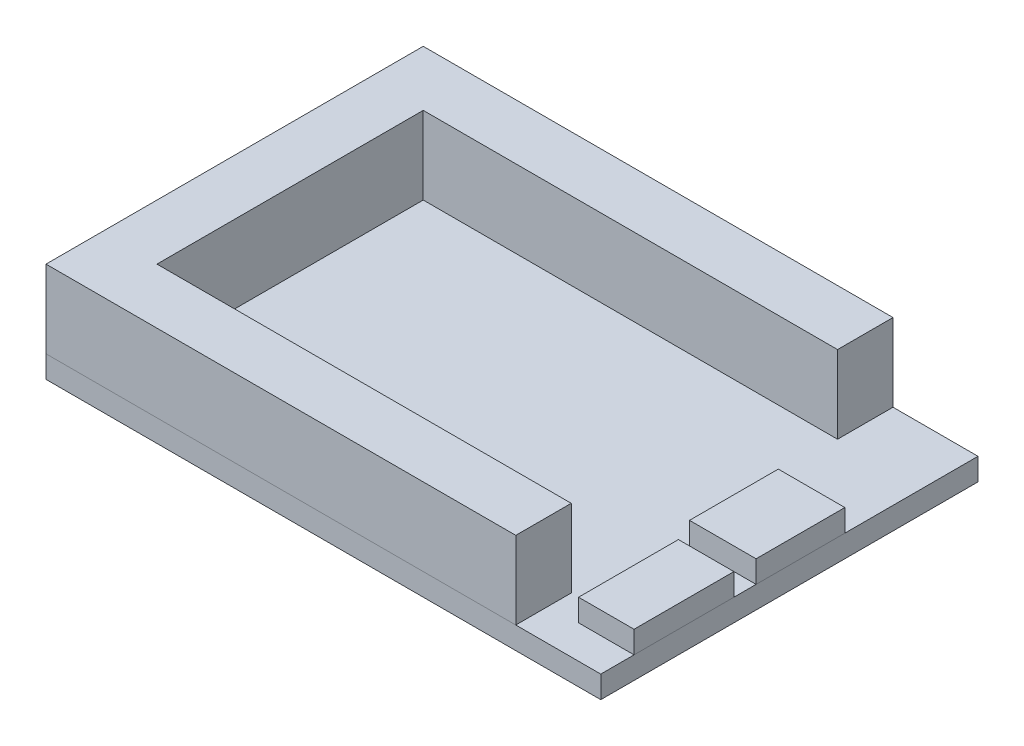
ISO-10303-21;
HEADER;
FILE_DESCRIPTION(('STEP AP214'),'2;1');
FILE_NAME('part.step','',(''),(''),'','','');
FILE_SCHEMA(('AUTOMOTIVE_DESIGN { 1 0 10303 214 1 1 1 1 }'));
ENDSEC;
DATA;
#1=APPLICATION_CONTEXT('core data for automotive mechanical design processes');
#2=APPLICATION_PROTOCOL_DEFINITION('international standard','automotive_design',2000,#1);
#3=PRODUCT_CONTEXT('',#1,'mechanical');
#4=PRODUCT('Part','Part','',(#3));
#5=PRODUCT_RELATED_PRODUCT_CATEGORY('part','',(#4));
#6=PRODUCT_DEFINITION_FORMATION('','',#4);
#7=PRODUCT_DEFINITION_CONTEXT('part definition',#1,'design');
#8=PRODUCT_DEFINITION('design','',#6,#7);
#9=PRODUCT_DEFINITION_SHAPE('','',#8);
#10=(LENGTH_UNIT() NAMED_UNIT(*) SI_UNIT(.MILLI.,.METRE.));
#11=(NAMED_UNIT(*) PLANE_ANGLE_UNIT() SI_UNIT($,.RADIAN.));
#12=(NAMED_UNIT(*) SI_UNIT($,.STERADIAN.) SOLID_ANGLE_UNIT());
#13=UNCERTAINTY_MEASURE_WITH_UNIT(LENGTH_MEASURE(1.E-05),#10,'distance_accuracy_value','');
#14=(GEOMETRIC_REPRESENTATION_CONTEXT(3) GLOBAL_UNCERTAINTY_ASSIGNED_CONTEXT((#13)) GLOBAL_UNIT_ASSIGNED_CONTEXT((#10,
#11,#12)) REPRESENTATION_CONTEXT('',''));
#15=CARTESIAN_POINT('',(0.,0.,0.));
#16=DIRECTION('',(0.,0.,1.));
#17=DIRECTION('',(1.,0.,0.));
#18=AXIS2_PLACEMENT_3D('',#15,#16,#17);
#19=CARTESIAN_POINT('',(17.3404490864808,9.,-17.));
#20=DIRECTION('',(0.,0.,1.));
#21=DIRECTION('',(1.,0.,0.));
#22=AXIS2_PLACEMENT_3D('',#19,#20,#21);
#23=PLANE('',#22);
#24=DIRECTION('',(-1.,0.,0.));
#25=VECTOR('',#24,1.);
#26=CARTESIAN_POINT('',(17.3404490864808,2.,-17.));
#27=LINE('',#26,#25);
#28=CARTESIAN_POINT('',(17.3404490864808,2.,-17.));
#29=VERTEX_POINT('',#28);
#30=CARTESIAN_POINT('',(-25.,2.,-17.));
#31=VERTEX_POINT('',#30);
#32=EDGE_CURVE('E150',#29,#31,#27,.T.);
#33=ORIENTED_EDGE('',*,*,#32,.T.);
#34=DIRECTION('',(0.,-1.,0.));
#35=VECTOR('',#34,1.);
#36=CARTESIAN_POINT('',(-25.,9.,-17.));
#37=LINE('',#36,#35);
#38=CARTESIAN_POINT('',(-25.,9.,-17.));
#39=VERTEX_POINT('',#38);
#40=EDGE_CURVE('E12',#39,#31,#37,.T.);
#41=ORIENTED_EDGE('',*,*,#40,.F.);
#42=DIRECTION('',(-1.,0.,0.));
#43=VECTOR('',#42,1.);
#44=CARTESIAN_POINT('',(17.3404490864808,9.,-17.));
#45=LINE('',#44,#43);
#46=CARTESIAN_POINT('',(17.3404490864808,9.,-17.));
#47=VERTEX_POINT('',#46);
#48=EDGE_CURVE('E164',#47,#39,#45,.T.);
#49=ORIENTED_EDGE('',*,*,#48,.F.);
#50=DIRECTION('',(0.,-1.,0.));
#51=VECTOR('',#50,1.);
#52=CARTESIAN_POINT('',(17.3404490864808,9.,-17.));
#53=LINE('',#52,#51);
#54=EDGE_CURVE('E146',#47,#29,#53,.T.);
#55=ORIENTED_EDGE('',*,*,#54,.T.);
#56=EDGE_LOOP('',(#33,#41,#49,#55));
#57=FACE_BOUND('',#56,.T.);
#58=ADVANCED_FACE('F54',(#57),#23,.F.);
#59=CARTESIAN_POINT('',(-25.,9.,-17.));
#60=DIRECTION('',(1.,0.,0.));
#61=DIRECTION('',(0.,0.,-1.));
#62=AXIS2_PLACEMENT_3D('',#59,#60,#61);
#63=PLANE('',#62);
#64=DIRECTION('',(0.,0.,1.));
#65=VECTOR('',#64,1.);
#66=CARTESIAN_POINT('',(-25.,2.,-17.));
#67=LINE('',#66,#65);
#68=CARTESIAN_POINT('',(-25.,2.,17.));
#69=VERTEX_POINT('',#68);
#70=EDGE_CURVE('E153',#31,#69,#67,.T.);
#71=ORIENTED_EDGE('',*,*,#70,.T.);
#72=DIRECTION('',(0.,-1.,0.));
#73=VECTOR('',#72,1.);
#74=CARTESIAN_POINT('',(-25.,9.,17.));
#75=LINE('',#74,#73);
#76=CARTESIAN_POINT('',(-25.,9.,17.));
#77=VERTEX_POINT('',#76);
#78=EDGE_CURVE('E62',#77,#69,#75,.T.);
#79=ORIENTED_EDGE('',*,*,#78,.F.);
#80=DIRECTION('',(0.,0.,1.));
#81=VECTOR('',#80,1.);
#82=CARTESIAN_POINT('',(-25.,9.,-17.));
#83=LINE('',#82,#81);
#84=EDGE_CURVE('E113',#39,#77,#83,.T.);
#85=ORIENTED_EDGE('',*,*,#84,.F.);
#86=ORIENTED_EDGE('',*,*,#40,.T.);
#87=EDGE_LOOP('',(#71,#79,#85,#86));
#88=FACE_BOUND('',#87,.T.);
#89=ADVANCED_FACE('F199',(#88),#63,.F.);
#90=CARTESIAN_POINT('',(-25.,9.,17.));
#91=DIRECTION('',(0.,0.,-1.));
#92=DIRECTION('',(-1.,0.,0.));
#93=AXIS2_PLACEMENT_3D('',#90,#91,#92);
#94=PLANE('',#93);
#95=DIRECTION('',(1.,0.,0.));
#96=VECTOR('',#95,1.);
#97=CARTESIAN_POINT('',(-25.,2.,17.));
#98=LINE('',#97,#96);
#99=CARTESIAN_POINT('',(17.3404490864808,2.,17.));
#100=VERTEX_POINT('',#99);
#101=EDGE_CURVE('E155',#69,#100,#98,.T.);
#102=ORIENTED_EDGE('',*,*,#101,.T.);
#103=DIRECTION('',(0.,-1.,0.));
#104=VECTOR('',#103,1.);
#105=CARTESIAN_POINT('',(17.3404490864808,9.,17.));
#106=LINE('',#105,#104);
#107=CARTESIAN_POINT('',(17.3404490864808,9.,17.));
#108=VERTEX_POINT('',#107);
#109=EDGE_CURVE('E171',#108,#100,#106,.T.);
#110=ORIENTED_EDGE('',*,*,#109,.F.);
#111=DIRECTION('',(1.,0.,0.));
#112=VECTOR('',#111,1.);
#113=CARTESIAN_POINT('',(-25.,9.,17.));
#114=LINE('',#113,#112);
#115=EDGE_CURVE('E179',#77,#108,#114,.T.);
#116=ORIENTED_EDGE('',*,*,#115,.F.);
#117=ORIENTED_EDGE('',*,*,#78,.T.);
#118=EDGE_LOOP('',(#102,#110,#116,#117));
#119=FACE_BOUND('',#118,.T.);
#120=ADVANCED_FACE('F177',(#119),#94,.F.);
#121=CARTESIAN_POINT('',(17.3404490864808,9.,12.));
#122=DIRECTION('',(-1.,0.,0.));
#123=DIRECTION('',(0.,0.,1.));
#124=AXIS2_PLACEMENT_3D('',#121,#122,#123);
#125=PLANE('',#124);
#126=DIRECTION('',(0.,0.,-1.));
#127=VECTOR('',#126,1.);
#128=CARTESIAN_POINT('',(17.3404490864808,2.,12.));
#129=LINE('',#128,#127);
#130=CARTESIAN_POINT('',(17.3404490864808,2.,12.));
#131=VERTEX_POINT('',#130);
#132=EDGE_CURVE('E157',#100,#131,#129,.T.);
#133=ORIENTED_EDGE('',*,*,#132,.T.);
#134=DIRECTION('',(0.,-1.,0.));
#135=VECTOR('',#134,1.);
#136=CARTESIAN_POINT('',(17.3404490864808,9.,12.));
#137=LINE('',#136,#135);
#138=CARTESIAN_POINT('',(17.3404490864808,9.,12.));
#139=VERTEX_POINT('',#138);
#140=EDGE_CURVE('E168',#139,#131,#137,.T.);
#141=ORIENTED_EDGE('',*,*,#140,.F.);
#142=DIRECTION('',(0.,0.,-1.));
#143=VECTOR('',#142,1.);
#144=CARTESIAN_POINT('',(17.3404490864808,9.,12.));
#145=LINE('',#144,#143);
#146=EDGE_CURVE('E191',#108,#139,#145,.T.);
#147=ORIENTED_EDGE('',*,*,#146,.F.);
#148=ORIENTED_EDGE('',*,*,#109,.T.);
#149=EDGE_LOOP('',(#133,#141,#147,#148));
#150=FACE_BOUND('',#149,.T.);
#151=ADVANCED_FACE('F187',(#150),#125,.F.);
#152=CARTESIAN_POINT('',(-20.,9.,12.));
#153=DIRECTION('',(0.,0.,1.));
#154=DIRECTION('',(1.,0.,0.));
#155=AXIS2_PLACEMENT_3D('',#152,#153,#154);
#156=PLANE('',#155);
#157=DIRECTION('',(-1.,0.,0.));
#158=VECTOR('',#157,1.);
#159=CARTESIAN_POINT('',(-20.,2.,12.));
#160=LINE('',#159,#158);
#161=CARTESIAN_POINT('',(-20.,2.,12.));
#162=VERTEX_POINT('',#161);
#163=EDGE_CURVE('E159',#131,#162,#160,.T.);
#164=ORIENTED_EDGE('',*,*,#163,.T.);
#165=DIRECTION('',(0.,-1.,0.));
#166=VECTOR('',#165,1.);
#167=CARTESIAN_POINT('',(-20.,9.,12.));
#168=LINE('',#167,#166);
#169=CARTESIAN_POINT('',(-20.,9.,12.));
#170=VERTEX_POINT('',#169);
#171=EDGE_CURVE('E141',#170,#162,#168,.T.);
#172=ORIENTED_EDGE('',*,*,#171,.F.);
#173=DIRECTION('',(-1.,0.,0.));
#174=VECTOR('',#173,1.);
#175=CARTESIAN_POINT('',(-20.,9.,12.));
#176=LINE('',#175,#174);
#177=EDGE_CURVE('E132',#139,#170,#176,.T.);
#178=ORIENTED_EDGE('',*,*,#177,.F.);
#179=ORIENTED_EDGE('',*,*,#140,.T.);
#180=EDGE_LOOP('',(#164,#172,#178,#179));
#181=FACE_BOUND('',#180,.T.);
#182=ADVANCED_FACE('F190',(#181),#156,.F.);
#183=CARTESIAN_POINT('',(-20.,9.,-12.));
#184=DIRECTION('',(-1.,0.,0.));
#185=DIRECTION('',(0.,0.,1.));
#186=AXIS2_PLACEMENT_3D('',#183,#184,#185);
#187=PLANE('',#186);
#188=DIRECTION('',(0.,0.,-1.));
#189=VECTOR('',#188,1.);
#190=CARTESIAN_POINT('',(-20.,2.,-12.));
#191=LINE('',#190,#189);
#192=CARTESIAN_POINT('',(-20.,2.,-12.));
#193=VERTEX_POINT('',#192);
#194=EDGE_CURVE('E140',#162,#193,#191,.T.);
#195=ORIENTED_EDGE('',*,*,#194,.T.);
#196=DIRECTION('',(0.,-1.,0.));
#197=VECTOR('',#196,1.);
#198=CARTESIAN_POINT('',(-20.,9.,-12.));
#199=LINE('',#198,#197);
#200=CARTESIAN_POINT('',(-20.,9.,-12.));
#201=VERTEX_POINT('',#200);
#202=EDGE_CURVE('E137',#201,#193,#199,.T.);
#203=ORIENTED_EDGE('',*,*,#202,.F.);
#204=DIRECTION('',(0.,0.,-1.));
#205=VECTOR('',#204,1.);
#206=CARTESIAN_POINT('',(-20.,9.,-12.));
#207=LINE('',#206,#205);
#208=EDGE_CURVE('E126',#170,#201,#207,.T.);
#209=ORIENTED_EDGE('',*,*,#208,.F.);
#210=ORIENTED_EDGE('',*,*,#171,.T.);
#211=EDGE_LOOP('',(#195,#203,#209,#210));
#212=FACE_BOUND('',#211,.T.);
#213=ADVANCED_FACE('F138',(#212),#187,.F.);
#214=CARTESIAN_POINT('',(17.3404490864808,9.,-12.));
#215=DIRECTION('',(0.,0.,-1.));
#216=DIRECTION('',(-1.,0.,0.));
#217=AXIS2_PLACEMENT_3D('',#214,#215,#216);
#218=PLANE('',#217);
#219=DIRECTION('',(1.,0.,0.));
#220=VECTOR('',#219,1.);
#221=CARTESIAN_POINT('',(17.3404490864808,2.,-12.));
#222=LINE('',#221,#220);
#223=CARTESIAN_POINT('',(17.3404490864808,2.,-12.));
#224=VERTEX_POINT('',#223);
#225=EDGE_CURVE('E99',#193,#224,#222,.T.);
#226=ORIENTED_EDGE('',*,*,#225,.T.);
#227=DIRECTION('',(0.,-1.,0.));
#228=VECTOR('',#227,1.);
#229=CARTESIAN_POINT('',(17.3404490864808,9.,-12.));
#230=LINE('',#229,#228);
#231=CARTESIAN_POINT('',(17.3404490864808,9.,-12.));
#232=VERTEX_POINT('',#231);
#233=EDGE_CURVE('E142',#232,#224,#230,.T.);
#234=ORIENTED_EDGE('',*,*,#233,.F.);
#235=DIRECTION('',(1.,0.,0.));
#236=VECTOR('',#235,1.);
#237=CARTESIAN_POINT('',(17.3404490864808,9.,-12.));
#238=LINE('',#237,#236);
#239=EDGE_CURVE('E130',#201,#232,#238,.T.);
#240=ORIENTED_EDGE('',*,*,#239,.F.);
#241=ORIENTED_EDGE('',*,*,#202,.T.);
#242=EDGE_LOOP('',(#226,#234,#240,#241));
#243=FACE_BOUND('',#242,.T.);
#244=ADVANCED_FACE('F144',(#243),#218,.F.);
#245=CARTESIAN_POINT('',(17.3404490864808,9.,-12.));
#246=DIRECTION('',(-1.,0.,0.));
#247=DIRECTION('',(0.,0.,1.));
#248=AXIS2_PLACEMENT_3D('',#245,#246,#247);
#249=PLANE('',#248);
#250=DIRECTION('',(0.,0.,-1.));
#251=VECTOR('',#250,1.);
#252=CARTESIAN_POINT('',(17.3404490864808,2.,-12.));
#253=LINE('',#252,#251);
#254=EDGE_CURVE('E105',#224,#29,#253,.T.);
#255=ORIENTED_EDGE('',*,*,#254,.T.);
#256=ORIENTED_EDGE('',*,*,#54,.F.);
#257=DIRECTION('',(0.,0.,-1.));
#258=VECTOR('',#257,1.);
#259=CARTESIAN_POINT('',(17.3404490864808,9.,-12.));
#260=LINE('',#259,#258);
#261=EDGE_CURVE('E70',#232,#47,#260,.T.);
#262=ORIENTED_EDGE('',*,*,#261,.F.);
#263=ORIENTED_EDGE('',*,*,#233,.T.);
#264=EDGE_LOOP('',(#255,#256,#262,#263));
#265=FACE_BOUND('',#264,.T.);
#266=ADVANCED_FACE('F215',(#265),#249,.F.);
#267=CARTESIAN_POINT('',(0.,9.,0.));
#268=DIRECTION('',(0.,1.,0.));
#269=DIRECTION('',(0.,0.,1.));
#270=AXIS2_PLACEMENT_3D('',#267,#268,#269);
#271=PLANE('',#270);
#272=ORIENTED_EDGE('',*,*,#48,.T.);
#273=ORIENTED_EDGE('',*,*,#84,.T.);
#274=ORIENTED_EDGE('',*,*,#115,.T.);
#275=ORIENTED_EDGE('',*,*,#146,.T.);
#276=ORIENTED_EDGE('',*,*,#177,.T.);
#277=ORIENTED_EDGE('',*,*,#208,.T.);
#278=ORIENTED_EDGE('',*,*,#239,.T.);
#279=ORIENTED_EDGE('',*,*,#261,.T.);
#280=EDGE_LOOP('',(#272,#273,#274,#275,#276,#277,#278,#279));
#281=FACE_BOUND('',#280,.T.);
#282=ADVANCED_FACE('F128',(#281),#271,.T.);
#283=CARTESIAN_POINT('',(0.,2.,0.));
#284=DIRECTION('',(0.,1.,0.));
#285=DIRECTION('',(0.,0.,1.));
#286=AXIS2_PLACEMENT_3D('',#283,#284,#285);
#287=PLANE('',#286);
#288=ORIENTED_EDGE('',*,*,#32,.F.);
#289=ORIENTED_EDGE('',*,*,#254,.F.);
#290=ORIENTED_EDGE('',*,*,#225,.F.);
#291=ORIENTED_EDGE('',*,*,#194,.F.);
#292=ORIENTED_EDGE('',*,*,#163,.F.);
#293=ORIENTED_EDGE('',*,*,#132,.F.);
#294=ORIENTED_EDGE('',*,*,#101,.F.);
#295=ORIENTED_EDGE('',*,*,#70,.F.);
#296=EDGE_LOOP('',(#288,#289,#290,#291,#292,#293,#294,#295));
#297=FACE_BOUND('',#296,.T.);
#298=ADVANCED_FACE('F183',(#297),#287,.F.);
#299=CLOSED_SHELL('',(#58,#89,#120,#151,#182,#213,#244,#266,#282,#298));
#300=MANIFOLD_SOLID_BREP('B2',#299);
#301=CARTESIAN_POINT('',(20.,4.,5.));
#302=DIRECTION('',(1.,0.,0.));
#303=DIRECTION('',(0.,0.,-1.));
#304=AXIS2_PLACEMENT_3D('',#301,#302,#303);
#305=PLANE('',#304);
#306=DIRECTION('',(0.,0.,1.));
#307=VECTOR('',#306,1.);
#308=CARTESIAN_POINT('',(20.,2.,5.));
#309=LINE('',#308,#307);
#310=CARTESIAN_POINT('',(20.,2.,5.));
#311=VERTEX_POINT('',#310);
#312=CARTESIAN_POINT('',(20.,2.,14.));
#313=VERTEX_POINT('',#312);
#314=EDGE_CURVE('E52',#311,#313,#309,.T.);
#315=ORIENTED_EDGE('',*,*,#314,.T.);
#316=DIRECTION('',(0.,-1.,0.));
#317=VECTOR('',#316,1.);
#318=CARTESIAN_POINT('',(20.,4.,14.));
#319=LINE('',#318,#317);
#320=CARTESIAN_POINT('',(20.,4.,14.));
#321=VERTEX_POINT('',#320);
#322=EDGE_CURVE('E383',#321,#313,#319,.T.);
#323=ORIENTED_EDGE('',*,*,#322,.F.);
#324=DIRECTION('',(0.,0.,1.));
#325=VECTOR('',#324,1.);
#326=CARTESIAN_POINT('',(20.,4.,5.));
#327=LINE('',#326,#325);
#328=CARTESIAN_POINT('',(20.,4.,5.));
#329=VERTEX_POINT('',#328);
#330=EDGE_CURVE('E316',#329,#321,#327,.T.);
#331=ORIENTED_EDGE('',*,*,#330,.F.);
#332=DIRECTION('',(0.,-1.,0.));
#333=VECTOR('',#332,1.);
#334=CARTESIAN_POINT('',(20.,4.,5.));
#335=LINE('',#334,#333);
#336=EDGE_CURVE('E371',#329,#311,#335,.T.);
#337=ORIENTED_EDGE('',*,*,#336,.T.);
#338=EDGE_LOOP('',(#315,#323,#331,#337));
#339=FACE_BOUND('',#338,.T.);
#340=ADVANCED_FACE('F312',(#339),#305,.F.);
#341=CARTESIAN_POINT('',(25.,4.,14.));
#342=DIRECTION('',(0.,0.,-1.));
#343=DIRECTION('',(-1.,0.,0.));
#344=AXIS2_PLACEMENT_3D('',#341,#342,#343);
#345=PLANE('',#344);
#346=DIRECTION('',(1.,0.,0.));
#347=VECTOR('',#346,1.);
#348=CARTESIAN_POINT('',(25.,2.,14.));
#349=LINE('',#348,#347);
#350=CARTESIAN_POINT('',(25.,2.,14.));
#351=VERTEX_POINT('',#350);
#352=EDGE_CURVE('E322',#313,#351,#349,.T.);
#353=ORIENTED_EDGE('',*,*,#352,.T.);
#354=DIRECTION('',(0.,-1.,0.));
#355=VECTOR('',#354,1.);
#356=CARTESIAN_POINT('',(25.,4.,14.));
#357=LINE('',#356,#355);
#358=CARTESIAN_POINT('',(25.,4.,14.));
#359=VERTEX_POINT('',#358);
#360=EDGE_CURVE('E367',#359,#351,#357,.T.);
#361=ORIENTED_EDGE('',*,*,#360,.F.);
#362=DIRECTION('',(1.,0.,0.));
#363=VECTOR('',#362,1.);
#364=CARTESIAN_POINT('',(25.,4.,14.));
#365=LINE('',#364,#363);
#366=EDGE_CURVE('E346',#321,#359,#365,.T.);
#367=ORIENTED_EDGE('',*,*,#366,.F.);
#368=ORIENTED_EDGE('',*,*,#322,.T.);
#369=EDGE_LOOP('',(#353,#361,#367,#368));
#370=FACE_BOUND('',#369,.T.);
#371=ADVANCED_FACE('F386',(#370),#345,.F.);
#372=CARTESIAN_POINT('',(25.,4.,5.));
#373=DIRECTION('',(-1.,0.,0.));
#374=DIRECTION('',(0.,0.,1.));
#375=AXIS2_PLACEMENT_3D('',#372,#373,#374);
#376=PLANE('',#375);
#377=DIRECTION('',(0.,0.,-1.));
#378=VECTOR('',#377,1.);
#379=CARTESIAN_POINT('',(25.,2.,5.));
#380=LINE('',#379,#378);
#381=CARTESIAN_POINT('',(25.,2.,5.));
#382=VERTEX_POINT('',#381);
#383=EDGE_CURVE('E362',#351,#382,#380,.T.);
#384=ORIENTED_EDGE('',*,*,#383,.T.);
#385=DIRECTION('',(0.,-1.,0.));
#386=VECTOR('',#385,1.);
#387=CARTESIAN_POINT('',(25.,4.,5.));
#388=LINE('',#387,#386);
#389=CARTESIAN_POINT('',(25.,4.,5.));
#390=VERTEX_POINT('',#389);
#391=EDGE_CURVE('E365',#390,#382,#388,.T.);
#392=ORIENTED_EDGE('',*,*,#391,.F.);
#393=DIRECTION('',(0.,0.,-1.));
#394=VECTOR('',#393,1.);
#395=CARTESIAN_POINT('',(25.,4.,5.));
#396=LINE('',#395,#394);
#397=EDGE_CURVE('E379',#359,#390,#396,.T.);
#398=ORIENTED_EDGE('',*,*,#397,.F.);
#399=ORIENTED_EDGE('',*,*,#360,.T.);
#400=EDGE_LOOP('',(#384,#392,#398,#399));
#401=FACE_BOUND('',#400,.T.);
#402=ADVANCED_FACE('F363',(#401),#376,.F.);
#403=CARTESIAN_POINT('',(25.,4.,5.));
#404=DIRECTION('',(0.,0.,1.));
#405=DIRECTION('',(1.,0.,0.));
#406=AXIS2_PLACEMENT_3D('',#403,#404,#405);
#407=PLANE('',#406);
#408=DIRECTION('',(-1.,0.,0.));
#409=VECTOR('',#408,1.);
#410=CARTESIAN_POINT('',(25.,2.,5.));
#411=LINE('',#410,#409);
#412=EDGE_CURVE('E356',#382,#311,#411,.T.);
#413=ORIENTED_EDGE('',*,*,#412,.T.);
#414=ORIENTED_EDGE('',*,*,#336,.F.);
#415=DIRECTION('',(-1.,0.,0.));
#416=VECTOR('',#415,1.);
#417=CARTESIAN_POINT('',(25.,4.,5.));
#418=LINE('',#417,#416);
#419=EDGE_CURVE('E370',#390,#329,#418,.T.);
#420=ORIENTED_EDGE('',*,*,#419,.F.);
#421=ORIENTED_EDGE('',*,*,#391,.T.);
#422=EDGE_LOOP('',(#413,#414,#420,#421));
#423=FACE_BOUND('',#422,.T.);
#424=ADVANCED_FACE('F369',(#423),#407,.F.);
#425=CARTESIAN_POINT('',(0.,4.,0.));
#426=DIRECTION('',(0.,-1.,0.));
#427=DIRECTION('',(0.,0.,-1.));
#428=AXIS2_PLACEMENT_3D('',#425,#426,#427);
#429=PLANE('',#428);
#430=ORIENTED_EDGE('',*,*,#330,.T.);
#431=ORIENTED_EDGE('',*,*,#366,.T.);
#432=ORIENTED_EDGE('',*,*,#397,.T.);
#433=ORIENTED_EDGE('',*,*,#419,.T.);
#434=EDGE_LOOP('',(#430,#431,#432,#433));
#435=FACE_BOUND('',#434,.T.);
#436=ADVANCED_FACE('F314',(#435),#429,.F.);
#437=CARTESIAN_POINT('',(0.,2.,0.));
#438=DIRECTION('',(0.,-1.,0.));
#439=DIRECTION('',(0.,0.,-1.));
#440=AXIS2_PLACEMENT_3D('',#437,#438,#439);
#441=PLANE('',#440);
#442=ORIENTED_EDGE('',*,*,#314,.F.);
#443=ORIENTED_EDGE('',*,*,#412,.F.);
#444=ORIENTED_EDGE('',*,*,#383,.F.);
#445=ORIENTED_EDGE('',*,*,#352,.F.);
#446=EDGE_LOOP('',(#442,#443,#444,#445));
#447=FACE_BOUND('',#446,.T.);
#448=ADVANCED_FACE('F373',(#447),#441,.T.);
#449=CLOSED_SHELL('',(#340,#371,#402,#424,#436,#448));
#450=MANIFOLD_SOLID_BREP('B6',#449);
#451=CARTESIAN_POINT('',(25.,4.,-5.));
#452=DIRECTION('',(-1.,0.,0.));
#453=DIRECTION('',(0.,0.,1.));
#454=AXIS2_PLACEMENT_3D('',#451,#452,#453);
#455=PLANE('',#454);
#456=DIRECTION('',(0.,0.,-1.));
#457=VECTOR('',#456,1.);
#458=CARTESIAN_POINT('',(25.,2.,-5.));
#459=LINE('',#458,#457);
#460=CARTESIAN_POINT('',(25.,2.,3.));
#461=VERTEX_POINT('',#460);
#462=CARTESIAN_POINT('',(25.,2.,-5.));
#463=VERTEX_POINT('',#462);
#464=EDGE_CURVE('E520',#461,#463,#459,.T.);
#465=ORIENTED_EDGE('',*,*,#464,.T.);
#466=DIRECTION('',(0.,-1.,0.));
#467=VECTOR('',#466,1.);
#468=CARTESIAN_POINT('',(25.,4.,-5.));
#469=LINE('',#468,#467);
#470=CARTESIAN_POINT('',(25.,4.,-5.));
#471=VERTEX_POINT('',#470);
#472=EDGE_CURVE('E310',#471,#463,#469,.T.);
#473=ORIENTED_EDGE('',*,*,#472,.F.);
#474=DIRECTION('',(0.,0.,-1.));
#475=VECTOR('',#474,1.);
#476=CARTESIAN_POINT('',(25.,4.,-5.));
#477=LINE('',#476,#475);
#478=CARTESIAN_POINT('',(25.,4.,3.));
#479=VERTEX_POINT('',#478);
#480=EDGE_CURVE('E508',#479,#471,#477,.T.);
#481=ORIENTED_EDGE('',*,*,#480,.F.);
#482=DIRECTION('',(0.,-1.,0.));
#483=VECTOR('',#482,1.);
#484=CARTESIAN_POINT('',(25.,4.,3.));
#485=LINE('',#484,#483);
#486=EDGE_CURVE('E516',#479,#461,#485,.T.);
#487=ORIENTED_EDGE('',*,*,#486,.T.);
#488=EDGE_LOOP('',(#465,#473,#481,#487));
#489=FACE_BOUND('',#488,.T.);
#490=ADVANCED_FACE('F457',(#489),#455,.F.);
#491=CARTESIAN_POINT('',(19.,4.,-5.));
#492=DIRECTION('',(0.,0.,1.));
#493=DIRECTION('',(1.,0.,0.));
#494=AXIS2_PLACEMENT_3D('',#491,#492,#493);
#495=PLANE('',#494);
#496=DIRECTION('',(-1.,0.,0.));
#497=VECTOR('',#496,1.);
#498=CARTESIAN_POINT('',(19.,2.,-5.));
#499=LINE('',#498,#497);
#500=CARTESIAN_POINT('',(19.,2.,-5.));
#501=VERTEX_POINT('',#500);
#502=EDGE_CURVE('E512',#463,#501,#499,.T.);
#503=ORIENTED_EDGE('',*,*,#502,.T.);
#504=DIRECTION('',(0.,-1.,0.));
#505=VECTOR('',#504,1.);
#506=CARTESIAN_POINT('',(19.,4.,-5.));
#507=LINE('',#506,#505);
#508=CARTESIAN_POINT('',(19.,4.,-5.));
#509=VERTEX_POINT('',#508);
#510=EDGE_CURVE('E465',#509,#501,#507,.T.);
#511=ORIENTED_EDGE('',*,*,#510,.F.);
#512=DIRECTION('',(-1.,0.,0.));
#513=VECTOR('',#512,1.);
#514=CARTESIAN_POINT('',(19.,4.,-5.));
#515=LINE('',#514,#513);
#516=EDGE_CURVE('E503',#471,#509,#515,.T.);
#517=ORIENTED_EDGE('',*,*,#516,.F.);
#518=ORIENTED_EDGE('',*,*,#472,.T.);
#519=EDGE_LOOP('',(#503,#511,#517,#518));
#520=FACE_BOUND('',#519,.T.);
#521=ADVANCED_FACE('F511',(#520),#495,.F.);
#522=CARTESIAN_POINT('',(19.,4.,-5.));
#523=DIRECTION('',(1.,0.,0.));
#524=DIRECTION('',(0.,0.,-1.));
#525=AXIS2_PLACEMENT_3D('',#522,#523,#524);
#526=PLANE('',#525);
#527=DIRECTION('',(0.,0.,1.));
#528=VECTOR('',#527,1.);
#529=CARTESIAN_POINT('',(19.,2.,-5.));
#530=LINE('',#529,#528);
#531=CARTESIAN_POINT('',(19.,2.,3.));
#532=VERTEX_POINT('',#531);
#533=EDGE_CURVE('E490',#501,#532,#530,.T.);
#534=ORIENTED_EDGE('',*,*,#533,.T.);
#535=DIRECTION('',(0.,-1.,0.));
#536=VECTOR('',#535,1.);
#537=CARTESIAN_POINT('',(19.,4.,3.));
#538=LINE('',#537,#536);
#539=CARTESIAN_POINT('',(19.,4.,3.));
#540=VERTEX_POINT('',#539);
#541=EDGE_CURVE('E513',#540,#532,#538,.T.);
#542=ORIENTED_EDGE('',*,*,#541,.F.);
#543=DIRECTION('',(0.,0.,1.));
#544=VECTOR('',#543,1.);
#545=CARTESIAN_POINT('',(19.,4.,-5.));
#546=LINE('',#545,#544);
#547=EDGE_CURVE('E506',#509,#540,#546,.T.);
#548=ORIENTED_EDGE('',*,*,#547,.F.);
#549=ORIENTED_EDGE('',*,*,#510,.T.);
#550=EDGE_LOOP('',(#534,#542,#548,#549));
#551=FACE_BOUND('',#550,.T.);
#552=ADVANCED_FACE('F514',(#551),#526,.F.);
#553=CARTESIAN_POINT('',(19.,4.,3.));
#554=DIRECTION('',(0.,0.,-1.));
#555=DIRECTION('',(-1.,0.,0.));
#556=AXIS2_PLACEMENT_3D('',#553,#554,#555);
#557=PLANE('',#556);
#558=DIRECTION('',(1.,0.,0.));
#559=VECTOR('',#558,1.);
#560=CARTESIAN_POINT('',(19.,2.,3.));
#561=LINE('',#560,#559);
#562=EDGE_CURVE('E496',#532,#461,#561,.T.);
#563=ORIENTED_EDGE('',*,*,#562,.T.);
#564=ORIENTED_EDGE('',*,*,#486,.F.);
#565=DIRECTION('',(1.,0.,0.));
#566=VECTOR('',#565,1.);
#567=CARTESIAN_POINT('',(19.,4.,3.));
#568=LINE('',#567,#566);
#569=EDGE_CURVE('E473',#540,#479,#568,.T.);
#570=ORIENTED_EDGE('',*,*,#569,.F.);
#571=ORIENTED_EDGE('',*,*,#541,.T.);
#572=EDGE_LOOP('',(#563,#564,#570,#571));
#573=FACE_BOUND('',#572,.T.);
#574=ADVANCED_FACE('F527',(#573),#557,.F.);
#575=CARTESIAN_POINT('',(0.,4.,0.));
#576=DIRECTION('',(0.,1.,0.));
#577=DIRECTION('',(0.,0.,1.));
#578=AXIS2_PLACEMENT_3D('',#575,#576,#577);
#579=PLANE('',#578);
#580=ORIENTED_EDGE('',*,*,#480,.T.);
#581=ORIENTED_EDGE('',*,*,#516,.T.);
#582=ORIENTED_EDGE('',*,*,#547,.T.);
#583=ORIENTED_EDGE('',*,*,#569,.T.);
#584=EDGE_LOOP('',(#580,#581,#582,#583));
#585=FACE_BOUND('',#584,.T.);
#586=ADVANCED_FACE('F504',(#585),#579,.T.);
#587=CARTESIAN_POINT('',(0.,2.,0.));
#588=DIRECTION('',(0.,1.,0.));
#589=DIRECTION('',(0.,0.,1.));
#590=AXIS2_PLACEMENT_3D('',#587,#588,#589);
#591=PLANE('',#590);
#592=ORIENTED_EDGE('',*,*,#464,.F.);
#593=ORIENTED_EDGE('',*,*,#562,.F.);
#594=ORIENTED_EDGE('',*,*,#533,.F.);
#595=ORIENTED_EDGE('',*,*,#502,.F.);
#596=EDGE_LOOP('',(#592,#593,#594,#595));
#597=FACE_BOUND('',#596,.T.);
#598=ADVANCED_FACE('F530',(#597),#591,.F.);
#599=CLOSED_SHELL('',(#490,#521,#552,#574,#586,#598));
#600=MANIFOLD_SOLID_BREP('B46',#599);
#601=CARTESIAN_POINT('',(-25.,2.,17.));
#602=DIRECTION('',(-1.,0.,0.));
#603=DIRECTION('',(0.,0.,1.));
#604=AXIS2_PLACEMENT_3D('',#601,#602,#603);
#605=PLANE('',#604);
#606=DIRECTION('',(0.,0.,-1.));
#607=VECTOR('',#606,1.);
#608=CARTESIAN_POINT('',(-25.,0.,17.));
#609=LINE('',#608,#607);
#610=CARTESIAN_POINT('',(-25.,0.,17.));
#611=VERTEX_POINT('',#610);
#612=CARTESIAN_POINT('',(-25.,0.,-17.));
#613=VERTEX_POINT('',#612);
#614=EDGE_CURVE('E658',#611,#613,#609,.T.);
#615=ORIENTED_EDGE('',*,*,#614,.F.);
#616=DIRECTION('',(0.,-1.,0.));
#617=VECTOR('',#616,1.);
#618=CARTESIAN_POINT('',(-25.,2.,17.));
#619=LINE('',#618,#617);
#620=CARTESIAN_POINT('',(-25.,2.,17.));
#621=VERTEX_POINT('',#620);
#622=EDGE_CURVE('E455',#621,#611,#619,.T.);
#623=ORIENTED_EDGE('',*,*,#622,.F.);
#624=DIRECTION('',(0.,0.,-1.));
#625=VECTOR('',#624,1.);
#626=CARTESIAN_POINT('',(-25.,2.,17.));
#627=LINE('',#626,#625);
#628=CARTESIAN_POINT('',(-25.,2.,-17.));
#629=VERTEX_POINT('',#628);
#630=EDGE_CURVE('E653',#621,#629,#627,.T.);
#631=ORIENTED_EDGE('',*,*,#630,.T.);
#632=DIRECTION('',(0.,-1.,0.));
#633=VECTOR('',#632,1.);
#634=CARTESIAN_POINT('',(-25.,2.,-17.));
#635=LINE('',#634,#633);
#636=EDGE_CURVE('E596',#629,#613,#635,.T.);
#637=ORIENTED_EDGE('',*,*,#636,.T.);
#638=EDGE_LOOP('',(#615,#623,#631,#637));
#639=FACE_BOUND('',#638,.T.);
#640=ADVANCED_FACE('F593',(#639),#605,.T.);
#641=CARTESIAN_POINT('',(-25.,2.,17.));
#642=DIRECTION('',(0.,0.,-1.));
#643=DIRECTION('',(-1.,0.,0.));
#644=AXIS2_PLACEMENT_3D('',#641,#642,#643);
#645=PLANE('',#644);
#646=DIRECTION('',(1.,0.,0.));
#647=VECTOR('',#646,1.);
#648=CARTESIAN_POINT('',(-25.,0.,17.));
#649=LINE('',#648,#647);
#650=CARTESIAN_POINT('',(25.,0.,17.));
#651=VERTEX_POINT('',#650);
#652=EDGE_CURVE('E626',#611,#651,#649,.T.);
#653=ORIENTED_EDGE('',*,*,#652,.T.);
#654=DIRECTION('',(0.,-1.,0.));
#655=VECTOR('',#654,1.);
#656=CARTESIAN_POINT('',(25.,2.,17.));
#657=LINE('',#656,#655);
#658=CARTESIAN_POINT('',(25.,2.,17.));
#659=VERTEX_POINT('',#658);
#660=EDGE_CURVE('E602',#659,#651,#657,.T.);
#661=ORIENTED_EDGE('',*,*,#660,.F.);
#662=DIRECTION('',(1.,0.,0.));
#663=VECTOR('',#662,1.);
#664=CARTESIAN_POINT('',(-25.,2.,17.));
#665=LINE('',#664,#663);
#666=EDGE_CURVE('E643',#621,#659,#665,.T.);
#667=ORIENTED_EDGE('',*,*,#666,.F.);
#668=ORIENTED_EDGE('',*,*,#622,.T.);
#669=EDGE_LOOP('',(#653,#661,#667,#668));
#670=FACE_BOUND('',#669,.T.);
#671=ADVANCED_FACE('F668',(#670),#645,.F.);
#672=CARTESIAN_POINT('',(25.,2.,17.));
#673=DIRECTION('',(-1.,0.,0.));
#674=DIRECTION('',(0.,0.,1.));
#675=AXIS2_PLACEMENT_3D('',#672,#673,#674);
#676=PLANE('',#675);
#677=DIRECTION('',(0.,0.,-1.));
#678=VECTOR('',#677,1.);
#679=CARTESIAN_POINT('',(25.,0.,17.));
#680=LINE('',#679,#678);
#681=CARTESIAN_POINT('',(25.,0.,-17.));
#682=VERTEX_POINT('',#681);
#683=EDGE_CURVE('E650',#651,#682,#680,.T.);
#684=ORIENTED_EDGE('',*,*,#683,.T.);
#685=DIRECTION('',(0.,-1.,0.));
#686=VECTOR('',#685,1.);
#687=CARTESIAN_POINT('',(25.,2.,-17.));
#688=LINE('',#687,#686);
#689=CARTESIAN_POINT('',(25.,2.,-17.));
#690=VERTEX_POINT('',#689);
#691=EDGE_CURVE('E647',#690,#682,#688,.T.);
#692=ORIENTED_EDGE('',*,*,#691,.F.);
#693=DIRECTION('',(0.,0.,-1.));
#694=VECTOR('',#693,1.);
#695=CARTESIAN_POINT('',(25.,2.,17.));
#696=LINE('',#695,#694);
#697=EDGE_CURVE('E638',#659,#690,#696,.T.);
#698=ORIENTED_EDGE('',*,*,#697,.F.);
#699=ORIENTED_EDGE('',*,*,#660,.T.);
#700=EDGE_LOOP('',(#684,#692,#698,#699));
#701=FACE_BOUND('',#700,.T.);
#702=ADVANCED_FACE('F648',(#701),#676,.F.);
#703=CARTESIAN_POINT('',(-25.,2.,-17.));
#704=DIRECTION('',(0.,0.,-1.));
#705=DIRECTION('',(-1.,0.,0.));
#706=AXIS2_PLACEMENT_3D('',#703,#704,#705);
#707=PLANE('',#706);
#708=DIRECTION('',(1.,0.,0.));
#709=VECTOR('',#708,1.);
#710=CARTESIAN_POINT('',(-25.,0.,-17.));
#711=LINE('',#710,#709);
#712=EDGE_CURVE('E661',#613,#682,#711,.T.);
#713=ORIENTED_EDGE('',*,*,#712,.F.);
#714=ORIENTED_EDGE('',*,*,#636,.F.);
#715=DIRECTION('',(1.,0.,0.));
#716=VECTOR('',#715,1.);
#717=CARTESIAN_POINT('',(-25.,2.,-17.));
#718=LINE('',#717,#716);
#719=EDGE_CURVE('E642',#629,#690,#718,.T.);
#720=ORIENTED_EDGE('',*,*,#719,.T.);
#721=ORIENTED_EDGE('',*,*,#691,.T.);
#722=EDGE_LOOP('',(#713,#714,#720,#721));
#723=FACE_BOUND('',#722,.T.);
#724=ADVANCED_FACE('F652',(#723),#707,.T.);
#725=CARTESIAN_POINT('',(0.,2.,0.));
#726=DIRECTION('',(0.,-1.,0.));
#727=DIRECTION('',(0.,0.,-1.));
#728=AXIS2_PLACEMENT_3D('',#725,#726,#727);
#729=PLANE('',#728);
#730=ORIENTED_EDGE('',*,*,#630,.F.);
#731=ORIENTED_EDGE('',*,*,#666,.T.);
#732=ORIENTED_EDGE('',*,*,#697,.T.);
#733=ORIENTED_EDGE('',*,*,#719,.F.);
#734=EDGE_LOOP('',(#730,#731,#732,#733));
#735=FACE_BOUND('',#734,.T.);
#736=ADVANCED_FACE('F641',(#735),#729,.F.);
#737=CARTESIAN_POINT('',(0.,0.,0.));
#738=DIRECTION('',(0.,-1.,0.));
#739=DIRECTION('',(0.,0.,-1.));
#740=AXIS2_PLACEMENT_3D('',#737,#738,#739);
#741=PLANE('',#740);
#742=ORIENTED_EDGE('',*,*,#614,.T.);
#743=ORIENTED_EDGE('',*,*,#712,.T.);
#744=ORIENTED_EDGE('',*,*,#683,.F.);
#745=ORIENTED_EDGE('',*,*,#652,.F.);
#746=EDGE_LOOP('',(#742,#743,#744,#745));
#747=FACE_BOUND('',#746,.T.);
#748=ADVANCED_FACE('F666',(#747),#741,.T.);
#749=CLOSED_SHELL('',(#640,#671,#702,#724,#736,#748));
#750=MANIFOLD_SOLID_BREP('B304',#749);
#751=ADVANCED_BREP_SHAPE_REPRESENTATION('',(#18,#300,#450,#600,#750),#14);
#752=SHAPE_DEFINITION_REPRESENTATION(#9,#751);
ENDSEC;
END-ISO-10303-21;
